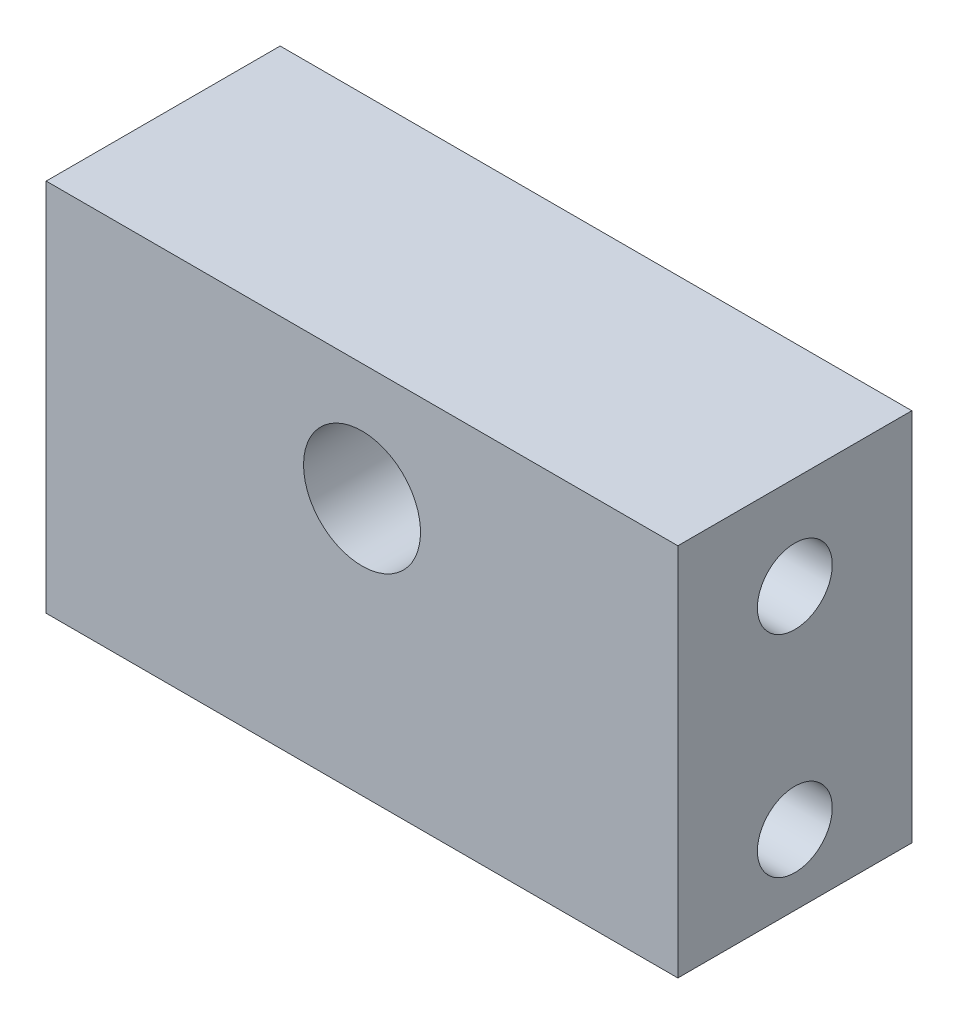
ISO-10303-21;
HEADER;
FILE_DESCRIPTION(('STEP AP214'),'2;1');
FILE_NAME('part.step','',(''),(''),'','','');
FILE_SCHEMA(('AUTOMOTIVE_DESIGN { 1 0 10303 214 1 1 1 1 }'));
ENDSEC;
DATA;
#1=APPLICATION_CONTEXT('core data for automotive mechanical design processes');
#2=APPLICATION_PROTOCOL_DEFINITION('international standard','automotive_design',2000,#1);
#3=PRODUCT_CONTEXT('',#1,'mechanical');
#4=PRODUCT('Part','Part','',(#3));
#5=PRODUCT_RELATED_PRODUCT_CATEGORY('part','',(#4));
#6=PRODUCT_DEFINITION_FORMATION('','',#4);
#7=PRODUCT_DEFINITION_CONTEXT('part definition',#1,'design');
#8=PRODUCT_DEFINITION('design','',#6,#7);
#9=PRODUCT_DEFINITION_SHAPE('','',#8);
#10=(LENGTH_UNIT() NAMED_UNIT(*) SI_UNIT(.MILLI.,.METRE.));
#11=(NAMED_UNIT(*) PLANE_ANGLE_UNIT() SI_UNIT($,.RADIAN.));
#12=(NAMED_UNIT(*) SI_UNIT($,.STERADIAN.) SOLID_ANGLE_UNIT());
#13=UNCERTAINTY_MEASURE_WITH_UNIT(LENGTH_MEASURE(1.E-05),#10,'distance_accuracy_value','');
#14=(GEOMETRIC_REPRESENTATION_CONTEXT(3) GLOBAL_UNCERTAINTY_ASSIGNED_CONTEXT((#13)) GLOBAL_UNIT_ASSIGNED_CONTEXT((#10,
#11,#12)) REPRESENTATION_CONTEXT('',''));
#15=CARTESIAN_POINT('',(0.,0.,0.));
#16=DIRECTION('',(0.,0.,1.));
#17=DIRECTION('',(1.,0.,0.));
#18=AXIS2_PLACEMENT_3D('',#15,#16,#17);
#19=CARTESIAN_POINT('',(0.,0.,5.));
#20=DIRECTION('',(1.,0.,0.));
#21=DIRECTION('',(0.,0.,-1.));
#22=AXIS2_PLACEMENT_3D('',#19,#20,#21);
#23=PLANE('',#22);
#24=CARTESIAN_POINT('',(0.,6.,2.5));
#25=DIRECTION('',(-1.,0.,0.));
#26=DIRECTION('',(0.,0.,1.));
#27=AXIS2_PLACEMENT_3D('',#24,#25,#26);
#28=CIRCLE('',#27,0.799999999999999);
#29=CARTESIAN_POINT('',(0.,6.,3.3));
#30=VERTEX_POINT('',#29);
#31=EDGE_CURVE('E124',#30,#30,#28,.T.);
#32=ORIENTED_EDGE('',*,*,#31,.F.);
#33=EDGE_LOOP('',(#32));
#34=FACE_BOUND('',#33,.T.);
#35=CARTESIAN_POINT('',(0.,1.5,2.5));
#36=DIRECTION('',(-1.,0.,0.));
#37=DIRECTION('',(0.,0.,1.));
#38=AXIS2_PLACEMENT_3D('',#35,#36,#37);
#39=CIRCLE('',#38,0.799999999999999);
#40=CARTESIAN_POINT('',(0.,1.5,3.3));
#41=VERTEX_POINT('',#40);
#42=EDGE_CURVE('E118',#41,#41,#39,.T.);
#43=ORIENTED_EDGE('',*,*,#42,.F.);
#44=EDGE_LOOP('',(#43));
#45=FACE_BOUND('',#44,.T.);
#46=DIRECTION('',(0.,-1.,0.));
#47=VECTOR('',#46,1.);
#48=CARTESIAN_POINT('',(0.,0.,0.));
#49=LINE('',#48,#47);
#50=CARTESIAN_POINT('',(0.,8.,0.));
#51=VERTEX_POINT('',#50);
#52=CARTESIAN_POINT('',(0.,0.,0.));
#53=VERTEX_POINT('',#52);
#54=EDGE_CURVE('E102',#51,#53,#49,.T.);
#55=ORIENTED_EDGE('',*,*,#54,.T.);
#56=DIRECTION('',(0.,0.,-1.));
#57=VECTOR('',#56,1.);
#58=CARTESIAN_POINT('',(0.,0.,5.));
#59=LINE('',#58,#57);
#60=CARTESIAN_POINT('',(0.,0.,5.));
#61=VERTEX_POINT('',#60);
#62=EDGE_CURVE('E11',#61,#53,#59,.T.);
#63=ORIENTED_EDGE('',*,*,#62,.F.);
#64=DIRECTION('',(0.,-1.,0.));
#65=VECTOR('',#64,1.);
#66=CARTESIAN_POINT('',(0.,0.,5.));
#67=LINE('',#66,#65);
#68=CARTESIAN_POINT('',(0.,8.,5.));
#69=VERTEX_POINT('',#68);
#70=EDGE_CURVE('E89',#69,#61,#67,.T.);
#71=ORIENTED_EDGE('',*,*,#70,.F.);
#72=DIRECTION('',(0.,0.,-1.));
#73=VECTOR('',#72,1.);
#74=CARTESIAN_POINT('',(0.,8.,5.));
#75=LINE('',#74,#73);
#76=EDGE_CURVE('E98',#69,#51,#75,.T.);
#77=ORIENTED_EDGE('',*,*,#76,.T.);
#78=EDGE_LOOP('',(#55,#63,#71,#77));
#79=FACE_BOUND('',#78,.T.);
#80=ADVANCED_FACE('F33',(#34,#45,#79),#23,.F.);
#81=CARTESIAN_POINT('',(0.,0.,5.));
#82=DIRECTION('',(0.,1.,0.));
#83=DIRECTION('',(0.,0.,1.));
#84=AXIS2_PLACEMENT_3D('',#81,#82,#83);
#85=PLANE('',#84);
#86=DIRECTION('',(1.,0.,0.));
#87=VECTOR('',#86,1.);
#88=CARTESIAN_POINT('',(0.,0.,0.));
#89=LINE('',#88,#87);
#90=CARTESIAN_POINT('',(13.5,0.,0.));
#91=VERTEX_POINT('',#90);
#92=EDGE_CURVE('E93',#53,#91,#89,.T.);
#93=ORIENTED_EDGE('',*,*,#92,.T.);
#94=DIRECTION('',(0.,0.,-1.));
#95=VECTOR('',#94,1.);
#96=CARTESIAN_POINT('',(13.5,0.,5.));
#97=LINE('',#96,#95);
#98=CARTESIAN_POINT('',(13.5,0.,5.));
#99=VERTEX_POINT('',#98);
#100=EDGE_CURVE('E46',#99,#91,#97,.T.);
#101=ORIENTED_EDGE('',*,*,#100,.F.);
#102=DIRECTION('',(1.,0.,0.));
#103=VECTOR('',#102,1.);
#104=CARTESIAN_POINT('',(0.,0.,5.));
#105=LINE('',#104,#103);
#106=EDGE_CURVE('E84',#61,#99,#105,.T.);
#107=ORIENTED_EDGE('',*,*,#106,.F.);
#108=ORIENTED_EDGE('',*,*,#62,.T.);
#109=EDGE_LOOP('',(#93,#101,#107,#108));
#110=FACE_BOUND('',#109,.T.);
#111=ADVANCED_FACE('F92',(#110),#85,.F.);
#112=CARTESIAN_POINT('',(13.5,0.,5.));
#113=DIRECTION('',(-1.,0.,0.));
#114=DIRECTION('',(0.,0.,1.));
#115=AXIS2_PLACEMENT_3D('',#112,#113,#114);
#116=PLANE('',#115);
#117=CARTESIAN_POINT('',(13.5,6.,2.5));
#118=DIRECTION('',(-1.,0.,0.));
#119=DIRECTION('',(0.,0.,1.));
#120=AXIS2_PLACEMENT_3D('',#117,#118,#119);
#121=CIRCLE('',#120,0.799999999999997);
#122=CARTESIAN_POINT('',(13.5,6.,3.3));
#123=VERTEX_POINT('',#122);
#124=EDGE_CURVE('E121',#123,#123,#121,.T.);
#125=ORIENTED_EDGE('',*,*,#124,.T.);
#126=EDGE_LOOP('',(#125));
#127=FACE_BOUND('',#126,.T.);
#128=CARTESIAN_POINT('',(13.5,1.5,2.5));
#129=DIRECTION('',(-1.,0.,0.));
#130=DIRECTION('',(0.,0.,1.));
#131=AXIS2_PLACEMENT_3D('',#128,#129,#130);
#132=CIRCLE('',#131,0.799999999999997);
#133=CARTESIAN_POINT('',(13.5,1.5,3.3));
#134=VERTEX_POINT('',#133);
#135=EDGE_CURVE('E105',#134,#134,#132,.T.);
#136=ORIENTED_EDGE('',*,*,#135,.T.);
#137=EDGE_LOOP('',(#136));
#138=FACE_BOUND('',#137,.T.);
#139=DIRECTION('',(0.,1.,0.));
#140=VECTOR('',#139,1.);
#141=CARTESIAN_POINT('',(13.5,0.,0.));
#142=LINE('',#141,#140);
#143=CARTESIAN_POINT('',(13.5,8.,0.));
#144=VERTEX_POINT('',#143);
#145=EDGE_CURVE('E71',#91,#144,#142,.T.);
#146=ORIENTED_EDGE('',*,*,#145,.T.);
#147=DIRECTION('',(0.,0.,-1.));
#148=VECTOR('',#147,1.);
#149=CARTESIAN_POINT('',(13.5,8.,5.));
#150=LINE('',#149,#148);
#151=CARTESIAN_POINT('',(13.5,8.,5.));
#152=VERTEX_POINT('',#151);
#153=EDGE_CURVE('E94',#152,#144,#150,.T.);
#154=ORIENTED_EDGE('',*,*,#153,.F.);
#155=DIRECTION('',(0.,1.,0.));
#156=VECTOR('',#155,1.);
#157=CARTESIAN_POINT('',(13.5,0.,5.));
#158=LINE('',#157,#156);
#159=EDGE_CURVE('E87',#99,#152,#158,.T.);
#160=ORIENTED_EDGE('',*,*,#159,.F.);
#161=ORIENTED_EDGE('',*,*,#100,.T.);
#162=EDGE_LOOP('',(#146,#154,#160,#161));
#163=FACE_BOUND('',#162,.T.);
#164=ADVANCED_FACE('F96',(#127,#138,#163),#116,.F.);
#165=CARTESIAN_POINT('',(0.,8.,5.));
#166=DIRECTION('',(0.,-1.,0.));
#167=DIRECTION('',(0.,0.,-1.));
#168=AXIS2_PLACEMENT_3D('',#165,#166,#167);
#169=PLANE('',#168);
#170=DIRECTION('',(-1.,0.,0.));
#171=VECTOR('',#170,1.);
#172=CARTESIAN_POINT('',(0.,8.,0.));
#173=LINE('',#172,#171);
#174=EDGE_CURVE('E77',#144,#51,#173,.T.);
#175=ORIENTED_EDGE('',*,*,#174,.T.);
#176=ORIENTED_EDGE('',*,*,#76,.F.);
#177=DIRECTION('',(-1.,0.,0.));
#178=VECTOR('',#177,1.);
#179=CARTESIAN_POINT('',(0.,8.,5.));
#180=LINE('',#179,#178);
#181=EDGE_CURVE('E54',#152,#69,#180,.T.);
#182=ORIENTED_EDGE('',*,*,#181,.F.);
#183=ORIENTED_EDGE('',*,*,#153,.T.);
#184=EDGE_LOOP('',(#175,#176,#182,#183));
#185=FACE_BOUND('',#184,.T.);
#186=ADVANCED_FACE('F110',(#185),#169,.F.);
#187=CARTESIAN_POINT('',(0.,0.,5.));
#188=DIRECTION('',(0.,0.,-1.));
#189=DIRECTION('',(-1.,0.,0.));
#190=AXIS2_PLACEMENT_3D('',#187,#188,#189);
#191=PLANE('',#190);
#192=CARTESIAN_POINT('',(6.75,5.5,5.));
#193=DIRECTION('',(0.,0.,-1.));
#194=DIRECTION('',(-1.,0.,0.));
#195=AXIS2_PLACEMENT_3D('',#192,#193,#194);
#196=CIRCLE('',#195,1.25);
#197=CARTESIAN_POINT('',(5.5,5.5,5.));
#198=VERTEX_POINT('',#197);
#199=EDGE_CURVE('E127',#198,#198,#196,.T.);
#200=ORIENTED_EDGE('',*,*,#199,.T.);
#201=EDGE_LOOP('',(#200));
#202=FACE_BOUND('',#201,.T.);
#203=ORIENTED_EDGE('',*,*,#70,.T.);
#204=ORIENTED_EDGE('',*,*,#106,.T.);
#205=ORIENTED_EDGE('',*,*,#159,.T.);
#206=ORIENTED_EDGE('',*,*,#181,.T.);
#207=EDGE_LOOP('',(#203,#204,#205,#206));
#208=FACE_BOUND('',#207,.T.);
#209=ADVANCED_FACE('F85',(#202,#208),#191,.F.);
#210=CARTESIAN_POINT('',(0.,0.,0.));
#211=DIRECTION('',(0.,0.,-1.));
#212=DIRECTION('',(-1.,0.,0.));
#213=AXIS2_PLACEMENT_3D('',#210,#211,#212);
#214=PLANE('',#213);
#215=CARTESIAN_POINT('',(6.75,5.5,0.));
#216=DIRECTION('',(0.,0.,-1.));
#217=DIRECTION('',(-1.,0.,0.));
#218=AXIS2_PLACEMENT_3D('',#215,#216,#217);
#219=CIRCLE('',#218,1.24999999999999);
#220=CARTESIAN_POINT('',(5.50000000000001,5.5,0.));
#221=VERTEX_POINT('',#220);
#222=EDGE_CURVE('E130',#221,#221,#219,.T.);
#223=ORIENTED_EDGE('',*,*,#222,.F.);
#224=EDGE_LOOP('',(#223));
#225=FACE_BOUND('',#224,.T.);
#226=ORIENTED_EDGE('',*,*,#54,.F.);
#227=ORIENTED_EDGE('',*,*,#174,.F.);
#228=ORIENTED_EDGE('',*,*,#145,.F.);
#229=ORIENTED_EDGE('',*,*,#92,.F.);
#230=EDGE_LOOP('',(#226,#227,#228,#229));
#231=FACE_BOUND('',#230,.T.);
#232=ADVANCED_FACE('F113',(#225,#231),#214,.T.);
#233=CARTESIAN_POINT('',(0.,1.5,2.5));
#234=DIRECTION('',(-1.,0.,0.));
#235=DIRECTION('',(0.,0.,1.));
#236=AXIS2_PLACEMENT_3D('',#233,#234,#235);
#237=CYLINDRICAL_SURFACE('',#236,0.799999999999998);
#238=ORIENTED_EDGE('',*,*,#135,.F.);
#239=EDGE_LOOP('',(#238));
#240=FACE_BOUND('',#239,.T.);
#241=ORIENTED_EDGE('',*,*,#42,.T.);
#242=EDGE_LOOP('',(#241));
#243=FACE_BOUND('',#242,.T.);
#244=ADVANCED_FACE('F138',(#240,#243),#237,.F.);
#245=CARTESIAN_POINT('',(0.,6.,2.5));
#246=DIRECTION('',(-1.,0.,0.));
#247=DIRECTION('',(0.,0.,1.));
#248=AXIS2_PLACEMENT_3D('',#245,#246,#247);
#249=CYLINDRICAL_SURFACE('',#248,0.799999999999998);
#250=CARTESIAN_POINT('',(7.89564392373895,6.,3.3));
#251=CARTESIAN_POINT('',(7.87548872729453,6.04617174227498,3.29999717256344));
#252=CARTESIAN_POINT('',(7.85248886386242,6.09117926520146,3.29597641699937));
#253=CARTESIAN_POINT('',(7.80176123741536,6.17736583311323,3.28132623239893));
#254=CARTESIAN_POINT('',(7.77401502367046,6.21852892964621,3.27067056740255));
#255=CARTESIAN_POINT('',(7.70719160452832,6.30625839129904,3.24085456786282));
#256=CARTESIAN_POINT('',(7.66703533031561,6.35149253986186,3.22021193077633));
#257=CARTESIAN_POINT('',(7.58242015040992,6.4343981492348,3.17347951714196));
#258=CARTESIAN_POINT('',(7.53795580718402,6.4720598630852,3.14738280726972));
#259=CARTESIAN_POINT('',(7.42832817034996,6.55290554383385,3.08131904518035));
#260=CARTESIAN_POINT('',(7.36167201599267,6.59283470071228,3.03982788887535));
#261=CARTESIAN_POINT('',(7.25761792121027,6.64293687422948,2.97682138782875));
#262=CARTESIAN_POINT('',(7.22221962519189,6.65801525115254,2.95567062816188));
#263=CARTESIAN_POINT('',(7.14983934843766,6.68495575679036,2.91405857229523));
#264=CARTESIAN_POINT('',(7.11285898855617,6.69682109008601,2.8935966070899));
#265=CARTESIAN_POINT('',(7.04280104410421,6.71567707558711,2.85797549198773));
#266=CARTESIAN_POINT('',(7.01001991733831,6.72314023445899,2.84248782848655));
#267=CARTESIAN_POINT('',(6.94262474581857,6.73554088745607,2.81496893586158));
#268=CARTESIAN_POINT('',(6.90801909315726,6.7404889926084,2.8029232807644));
#269=CARTESIAN_POINT('',(6.84695648392694,6.74649575225038,2.7877385042272));
#270=CARTESIAN_POINT('',(6.82097999614214,6.74826024795817,2.78304084729228));
#271=CARTESIAN_POINT('',(6.7685749415377,6.75013522322355,2.77803936439854));
#272=CARTESIAN_POINT('',(6.74214764644519,6.75024976782914,2.77772473985715));
#273=CARTESIAN_POINT('',(6.68976157896732,6.74882278800921,2.78154396181546));
#274=CARTESIAN_POINT('',(6.6638017579813,6.74728561413872,2.78566612206392));
#275=CARTESIAN_POINT('',(6.61275992841022,6.74270943575801,2.79735595232112));
#276=CARTESIAN_POINT('',(6.58768160233448,6.73966478537514,2.80493656664584));
#277=CARTESIAN_POINT('',(6.53676950131497,6.73196755957711,2.82299545794279));
#278=CARTESIAN_POINT('',(6.51101434705847,6.72721378013521,2.83364494483603));
#279=CARTESIAN_POINT('',(6.46050167302896,6.71628876371659,2.8565002641666));
#280=CARTESIAN_POINT('',(6.43574539082027,6.71011582823644,2.86870795367342));
#281=CARTESIAN_POINT('',(6.36255077308224,6.6895229790294,2.90667120296159));
#282=CARTESIAN_POINT('',(6.31535282350618,6.67305548077449,2.93369696403713));
#283=CARTESIAN_POINT('',(6.20014711699658,6.62507361106977,3.00179876611414));
#284=CARTESIAN_POINT('',(6.13366608109514,6.59016013437987,3.04307843867841));
#285=CARTESIAN_POINT('',(6.0062905177232,6.50752483865855,3.12100388112887));
#286=CARTESIAN_POINT('',(5.94537751558615,6.45984760488785,3.15766514028952));
#287=CARTESIAN_POINT('',(5.85262491025071,6.37156965023453,3.20956303482814));
#288=CARTESIAN_POINT('',(5.8184811444361,6.33507569643976,3.22766649239364));
#289=CARTESIAN_POINT('',(5.75394854957166,6.25692704808001,3.25878322513266));
#290=CARTESIAN_POINT('',(5.72355510049954,6.215278832413,3.27180280684132));
#291=CARTESIAN_POINT('',(5.67239009199917,6.13491844053325,3.28942154629186));
#292=CARTESIAN_POINT('',(5.65086215633491,6.09692539744352,3.29508106763304));
#293=CARTESIAN_POINT('',(5.61178021825676,6.01852557048933,3.30074820855348));
#294=CARTESIAN_POINT('',(5.59422384389321,5.97812024564397,3.30075921057307));
#295=CARTESIAN_POINT('',(5.56351466008368,5.89584264945666,3.29426890591267));
#296=CARTESIAN_POINT('',(5.55039090660528,5.85396261309722,3.28772570328019));
#297=CARTESIAN_POINT('',(5.52889896016437,5.77066724145759,3.26761903643831));
#298=CARTESIAN_POINT('',(5.52052909221142,5.7292517475479,3.25405804810754));
#299=CARTESIAN_POINT('',(5.50886663742481,5.65302114395124,3.22189405762136));
#300=CARTESIAN_POINT('',(5.50512436017983,5.61797552903164,3.2039912608846));
#301=CARTESIAN_POINT('',(5.50057707672743,5.55076889019275,3.1631276657149));
#302=CARTESIAN_POINT('',(5.49977240314292,5.51860819333294,3.14016629481506));
#303=CARTESIAN_POINT('',(5.50034310067327,5.45734870870009,3.08919800826044));
#304=CARTESIAN_POINT('',(5.50176881873946,5.42833690802275,3.06108758729229));
#305=CARTESIAN_POINT('',(5.50598562462388,5.37490921870263,3.00088235956416));
#306=CARTESIAN_POINT('',(5.50877727165921,5.35049521809291,2.96878592493269));
#307=CARTESIAN_POINT('',(5.51509454227737,5.30484077211193,2.89833068416572));
#308=CARTESIAN_POINT('',(5.51866325197198,5.28407221754508,2.85966905985201));
#309=CARTESIAN_POINT('',(5.52530667383055,5.24911274903194,2.77943473282814));
#310=CARTESIAN_POINT('',(5.52838133603791,5.23492249999103,2.73786173633824));
#311=CARTESIAN_POINT('',(5.53328916198274,5.2132175027203,2.65166619824402));
#312=CARTESIAN_POINT('',(5.5350847106156,5.20590313231551,2.60699064094628));
#313=CARTESIAN_POINT('',(5.53679829997118,5.19890959851793,2.51701571576571));
#314=CARTESIAN_POINT('',(5.53671672839613,5.19922885846826,2.47171647862993));
#315=CARTESIAN_POINT('',(5.53472939789424,5.20736893243123,2.38312517170757));
#316=CARTESIAN_POINT('',(5.5328747075658,5.21497975114347,2.33981239488434));
#317=CARTESIAN_POINT('',(5.52789510157369,5.23715522940638,2.25507788912143));
#318=CARTESIAN_POINT('',(5.52476987324219,5.25172160080935,2.21365662845963));
#319=CARTESIAN_POINT('',(5.51803344808734,5.28764351068861,2.13323841753078));
#320=CARTESIAN_POINT('',(5.51441625459651,5.30908813844085,2.09428179447366));
#321=CARTESIAN_POINT('',(5.50782695007765,5.35816381475864,2.02040320862303));
#322=CARTESIAN_POINT('',(5.50485496565899,5.38579607536626,1.98548203833412));
#323=CARTESIAN_POINT('',(5.500745302486,5.44696128770861,1.92019398817851));
#324=CARTESIAN_POINT('',(5.49963309966984,5.48056932335081,1.88989544729262));
#325=CARTESIAN_POINT('',(5.50058407400249,5.55238267162382,1.83542099898793));
#326=CARTESIAN_POINT('',(5.50264469744475,5.59058426423795,1.81124018583954));
#327=CARTESIAN_POINT('',(5.5106867803411,5.66726870109894,1.77128734687062));
#328=CARTESIAN_POINT('',(5.51637370000974,5.70553111826453,1.75503342613718));
#329=CARTESIAN_POINT('',(5.5318906264256,5.78333715900927,1.72880551251343));
#330=CARTESIAN_POINT('',(5.54171907815071,5.82288029657699,1.71882916608241));
#331=CARTESIAN_POINT('',(5.56482660680584,5.89918838905699,1.70549303869837));
#332=CARTESIAN_POINT('',(5.57784170606756,5.93596776925713,1.70174740229521));
#333=CARTESIAN_POINT('',(5.60733432417476,6.00827266072829,1.69922449545665));
#334=CARTESIAN_POINT('',(5.62381260596054,6.04379789369274,1.70044832088561));
#335=CARTESIAN_POINT('',(5.66104742417397,6.11515075998059,1.7074646844225));
#336=CARTESIAN_POINT('',(5.68201860921848,6.15083485920608,1.7135620694136));
#337=CARTESIAN_POINT('',(5.72687397653054,6.21930009286652,1.72983903569806));
#338=CARTESIAN_POINT('',(5.75075973364536,6.25207964121001,1.7400208308012));
#339=CARTESIAN_POINT('',(5.81530782073494,6.33235369170949,1.77041428746891));
#340=CARTESIAN_POINT('',(5.85774112197448,6.37751820933552,1.79303014293276));
#341=CARTESIAN_POINT('',(5.94700933229882,6.45990637398643,1.8436209985806));
#342=CARTESIAN_POINT('',(5.99385775657128,6.49710441749358,1.87161274547337));
#343=CARTESIAN_POINT('',(6.07511891379766,6.55290563556056,1.92103896498509));
#344=CARTESIAN_POINT('',(6.10861969080894,6.57362148845062,1.94164457064483));
#345=CARTESIAN_POINT('',(6.17709263283523,6.61167149938681,1.98360869978042));
#346=CARTESIAN_POINT('',(6.21206606983738,6.62900265797543,2.00496787144427));
#347=CARTESIAN_POINT('',(6.28348960722747,6.66034039221704,2.04761748893026));
#348=CARTESIAN_POINT('',(6.31993927998415,6.67434792269746,2.06890795275313));
#349=CARTESIAN_POINT('',(6.39458170492601,6.69905105619306,2.11025390250877));
#350=CARTESIAN_POINT('',(6.43277180845744,6.70975151084067,2.13031116264387));
#351=CARTESIAN_POINT('',(6.50250380867166,6.7256483742637,2.16283046651772));
#352=CARTESIAN_POINT('',(6.53355698481776,6.73154452843531,2.17597874598209));
#353=CARTESIAN_POINT('',(6.59729454345371,6.74105117300654,2.19835210161576));
#354=CARTESIAN_POINT('',(6.62996822483459,6.74467493917351,2.20759985950506));
#355=CARTESIAN_POINT('',(6.68902286784346,6.74877591448388,2.21828754548258));
#356=CARTESIAN_POINT('',(6.71511343545647,6.74978669611786,2.2210378181918));
#357=CARTESIAN_POINT('',(6.76738523641873,6.75015204395093,2.22202073448697));
#358=CARTESIAN_POINT('',(6.79356641578282,6.74950746807363,2.22025571821757));
#359=CARTESIAN_POINT('',(6.85307734764856,6.74620061535597,2.21153862871483));
#360=CARTESIAN_POINT('',(6.8861543221051,6.74298334583936,2.2031698183117));
#361=CARTESIAN_POINT('',(6.95068170822066,6.73422105326288,2.18212120574504));
#362=CARTESIAN_POINT('',(6.98211990023111,6.72866075900748,2.16941322704896));
#363=CARTESIAN_POINT('',(7.0460103020543,6.71491957378917,2.14060303743088));
#364=CARTESIAN_POINT('',(7.07833421800153,6.70656115948492,2.12430793117877));
#365=CARTESIAN_POINT('',(7.14164373753235,6.68752149181098,2.09049555347823));
#366=CARTESIAN_POINT('',(7.17262791163128,6.67683782733636,2.07297702633871));
#367=CARTESIAN_POINT('',(7.26392343290892,6.64133961391157,2.01991173375082));
#368=CARTESIAN_POINT('',(7.32262542793334,6.61306728951029,1.98383043097432));
#369=CARTESIAN_POINT('',(7.43361815168714,6.54838149348504,1.91569735108891));
#370=CARTESIAN_POINT('',(7.48607546885591,6.51236613119953,1.8835393960893));
#371=CARTESIAN_POINT('',(7.58648304423865,6.43109979172819,1.82422529521582));
#372=CARTESIAN_POINT('',(7.63444284663586,6.38586904930203,1.79705843448093));
#373=CARTESIAN_POINT('',(7.71087939425737,6.30089785212438,1.75773662321341));
#374=CARTESIAN_POINT('',(7.74091197509637,6.26351688742812,1.7435195152374));
#375=CARTESIAN_POINT('',(7.79710160845275,6.18441289604985,1.72046000205651));
#376=CARTESIAN_POINT('',(7.82326361459284,6.14269553770487,1.71161068128516));
#377=CARTESIAN_POINT('',(7.86696555205851,6.06269166028287,1.70161109120104));
#378=CARTESIAN_POINT('',(7.88521520738592,6.0249218290622,1.69945666727598));
#379=CARTESIAN_POINT('',(7.91778426788389,5.94780291168519,1.70077582925808));
#380=CARTESIAN_POINT('',(7.93210580774116,5.90845469666274,1.7042463512431));
#381=CARTESIAN_POINT('',(7.95656179932905,5.82928990058383,1.71739306824483));
#382=CARTESIAN_POINT('',(7.96667840776122,5.78947204633592,1.72709527288932));
#383=CARTESIAN_POINT('',(7.98270196688784,5.7110634513505,1.75286025011502));
#384=CARTESIAN_POINT('',(7.98860895842527,5.67247269871076,1.76892296098232));
#385=CARTESIAN_POINT('',(7.99643256884186,5.60061144298917,1.80573442135716));
#386=CARTESIAN_POINT('',(7.99859966265298,5.5671576195866,1.82607623674723));
#387=CARTESIAN_POINT('',(8.00040042159135,5.50354301531203,1.87146351805504));
#388=CARTESIAN_POINT('',(8.0000336131768,5.4733828510369,1.8965098623157));
#389=CARTESIAN_POINT('',(7.99750128849887,5.41561387249978,1.95211012723249));
#390=CARTESIAN_POINT('',(7.9952427196488,5.38822093713679,1.98288355803922));
#391=CARTESIAN_POINT('',(7.98977657029719,5.33850423817409,2.04821437147767));
#392=CARTESIAN_POINT('',(7.98656857214118,5.31618271314546,2.08277341517954));
#393=CARTESIAN_POINT('',(7.97985760564229,5.27547319770694,2.15789906059265));
#394=CARTESIAN_POINT('',(7.97635221274064,5.25756411274045,2.19872616337744));
#395=CARTESIAN_POINT('',(7.97030463980113,5.22875286433352,2.28284958356121));
#396=CARTESIAN_POINT('',(7.96776238302267,5.21785014259298,2.3261457039178));
#397=CARTESIAN_POINT('',(7.96431046540586,5.20333928149687,2.41432155129455));
#398=CARTESIAN_POINT('',(7.96341211466456,5.19978165521142,2.45921009892756));
#399=CARTESIAN_POINT('',(7.96352523956406,5.20023911294653,2.54894206000694));
#400=CARTESIAN_POINT('',(7.96453653016803,5.20425346327199,2.59378547740499));
#401=CARTESIAN_POINT('',(7.96815000380391,5.21952057439748,2.68101058058196));
#402=CARTESIAN_POINT('',(7.97071259993828,5.2305935709035,2.72342566200858));
#403=CARTESIAN_POINT('',(7.97672964455647,5.25947853220969,2.80583584874133));
#404=CARTESIAN_POINT('',(7.98018437084468,5.27729259694697,2.84583019544684));
#405=CARTESIAN_POINT('',(7.9871204108962,5.31970949544935,2.92332388392881));
#406=CARTESIAN_POINT('',(7.99060032484841,5.34446702451276,2.96073879544933));
#407=CARTESIAN_POINT('',(7.99630024003757,5.39994428125958,3.03097539272564));
#408=CARTESIAN_POINT('',(7.99852030578996,5.43066370353286,3.06379731361856));
#409=CARTESIAN_POINT('',(8.00043438646744,5.49704869116042,3.12372083785322));
#410=CARTESIAN_POINT('',(8.00014173812689,5.53268715581859,3.15085186058161));
#411=CARTESIAN_POINT('',(7.9959053000062,5.60784467499195,3.19870898319168));
#412=CARTESIAN_POINT('',(7.99196368133885,5.6473614094648,3.21943888191925));
#413=CARTESIAN_POINT('',(7.98011770948734,5.72523137375591,3.25242171646077));
#414=CARTESIAN_POINT('',(7.97257666470321,5.76340038706006,3.2652432753833));
#415=CARTESIAN_POINT('',(7.95345664956823,5.84022398040642,3.28488135552311));
#416=CARTESIAN_POINT('',(7.94188394957808,5.87887771709167,3.29170714413708));
#417=CARTESIAN_POINT('',(7.923421946964,5.931048567674,3.29714777825909));
#418=CARTESIAN_POINT('',(7.9182170613791,5.94496047923011,3.29822460696997));
#419=CARTESIAN_POINT('',(7.90730534971228,5.97261541159014,3.2996509409171));
#420=CARTESIAN_POINT('',(7.9015987939416,5.98635851885464,3.30000083536857));
#421=CARTESIAN_POINT('',(7.89564392373895,6.,3.3));
#422=B_SPLINE_CURVE_WITH_KNOTS('',3,(#250,#251,#252,#253,#254,#255,#256,#257,#258,#259,#260,
#261,#262,#263,#264,#265,#266,#267,#268,#269,#270,#271,#272,#273,#274,#275,#276,#277,#278,#279,
#280,#281,#282,#283,#284,#285,#286,#287,#288,#289,#290,#291,#292,#293,#294,#295,#296,#297,#298,
#299,#300,#301,#302,#303,#304,#305,#306,#307,#308,#309,#310,#311,#312,#313,#314,#315,#316,#317,
#318,#319,#320,#321,#322,#323,#324,#325,#326,#327,#328,#329,#330,#331,#332,#333,#334,#335,#336,
#337,#338,#339,#340,#341,#342,#343,#344,#345,#346,#347,#348,#349,#350,#351,#352,#353,#354,#355,
#356,#357,#358,#359,#360,#361,#362,#363,#364,#365,#366,#367,#368,#369,#370,#371,#372,#373,#374,
#375,#376,#377,#378,#379,#380,#381,#382,#383,#384,#385,#386,#387,#388,#389,#390,#391,#392,#393,
#394,#395,#396,#397,#398,#399,#400,#401,#402,#403,#404,#405,#406,#407,#408,#409,#410,#411,#412,
#413,#414,#415,#416,#417,#418,#419,#420,#421),.UNSPECIFIED.,.T.,.F.,(4,2,2,2,2,2,2,2,2,2,2,2,2,
2,2,2,2,2,2,2,2,2,2,2,2,2,2,2,2,2,2,2,2,2,2,2,2,2,2,2,2,2,2,2,2,2,2,2,2,2,2,2,2,2,2,2,2,2,2,2,2,
2,2,2,2,2,2,2,2,2,2,2,2,2,2,2,2,2,2,2,2,2,2,2,2,4),(0.,0.151071315656736,0.302743829222993,
0.49341615049592,0.684332348774773,0.947089237596168,1.07871602736853,1.21021104942995,
1.32110124585149,1.4315196295145,1.51054520808841,1.58937605490956,1.66799977251688,
1.74692020853685,1.83160525849154,1.91639219550631,2.08650814746932,2.34252642686624,
2.59766181750013,2.75662623496339,2.91539282620482,3.04696319979022,3.17845478645265,
3.31079229514482,3.44308314688903,3.56112822277391,3.67918666440978,3.7999487481429,
3.92076031380478,4.05226071442009,4.1837744036052,4.31901162401884,4.45422091265633,
4.5856497088799,4.71711086813047,4.85034860792232,4.98361246937216,5.11868730556485,
5.25365348115058,5.37885226531671,5.50400408289045,5.62106972559927,5.73816118499317,
5.86321043218094,5.98832754966019,6.18513226745306,6.38256030849836,6.51576739470188,
6.64909199633917,6.78237824935962,6.91546802682137,7.01797702093959,7.11988141569569,
7.19823996965406,7.27655792085197,7.37874142263177,7.48160148928415,7.59289739556368,
7.70430926164815,7.92697013125325,8.14014588032463,8.35285849594387,8.50239201260741,
8.6517324669178,8.77721374932501,8.90262670473082,9.02856653711024,9.15450514756667,
9.27162434848585,9.38876543751734,9.51203190709497,9.63535268246427,9.76888726203143,
9.90241119961261,10.0368503788142,10.1712765320507,10.3024089982194,10.4335823476592,
10.5679486856139,10.702308142195,10.8359549016383,10.969522193231,11.0917940119992,
11.213876506384,11.2585345741088,11.3031687248381),.UNSPECIFIED.);
#423=CARTESIAN_POINT('',(7.89564392373895,6.,3.3));
#424=VERTEX_POINT('',#423);
#425=EDGE_CURVE('E36',#424,#424,#422,.T.);
#426=ORIENTED_EDGE('',*,*,#425,.T.);
#427=EDGE_LOOP('',(#426));
#428=FACE_BOUND('',#427,.T.);
#429=ORIENTED_EDGE('',*,*,#124,.F.);
#430=EDGE_LOOP('',(#429));
#431=FACE_BOUND('',#430,.T.);
#432=ORIENTED_EDGE('',*,*,#31,.T.);
#433=EDGE_LOOP('',(#432));
#434=FACE_BOUND('',#433,.T.);
#435=ADVANCED_FACE('F144',(#428,#431,#434),#249,.F.);
#436=CARTESIAN_POINT('',(6.75,5.5,0.));
#437=DIRECTION('',(0.,0.,-1.));
#438=DIRECTION('',(-1.,0.,0.));
#439=AXIS2_PLACEMENT_3D('',#436,#437,#438);
#440=CYLINDRICAL_SURFACE('',#439,1.24999999999999);
#441=ORIENTED_EDGE('',*,*,#222,.T.);
#442=EDGE_LOOP('',(#441));
#443=FACE_BOUND('',#442,.T.);
#444=ORIENTED_EDGE('',*,*,#199,.F.);
#445=EDGE_LOOP('',(#444));
#446=FACE_BOUND('',#445,.T.);
#447=ORIENTED_EDGE('',*,*,#425,.F.);
#448=EDGE_LOOP('',(#447));
#449=FACE_BOUND('',#448,.T.);
#450=ADVANCED_FACE('F134',(#443,#446,#449),#440,.F.);
#451=CLOSED_SHELL('',(#80,#111,#164,#186,#209,#232,#244,#435,#450));
#452=MANIFOLD_SOLID_BREP('B2',#451);
#453=ADVANCED_BREP_SHAPE_REPRESENTATION('',(#18,#452),#14);
#454=SHAPE_DEFINITION_REPRESENTATION(#9,#453);
ENDSEC;
END-ISO-10303-21;
